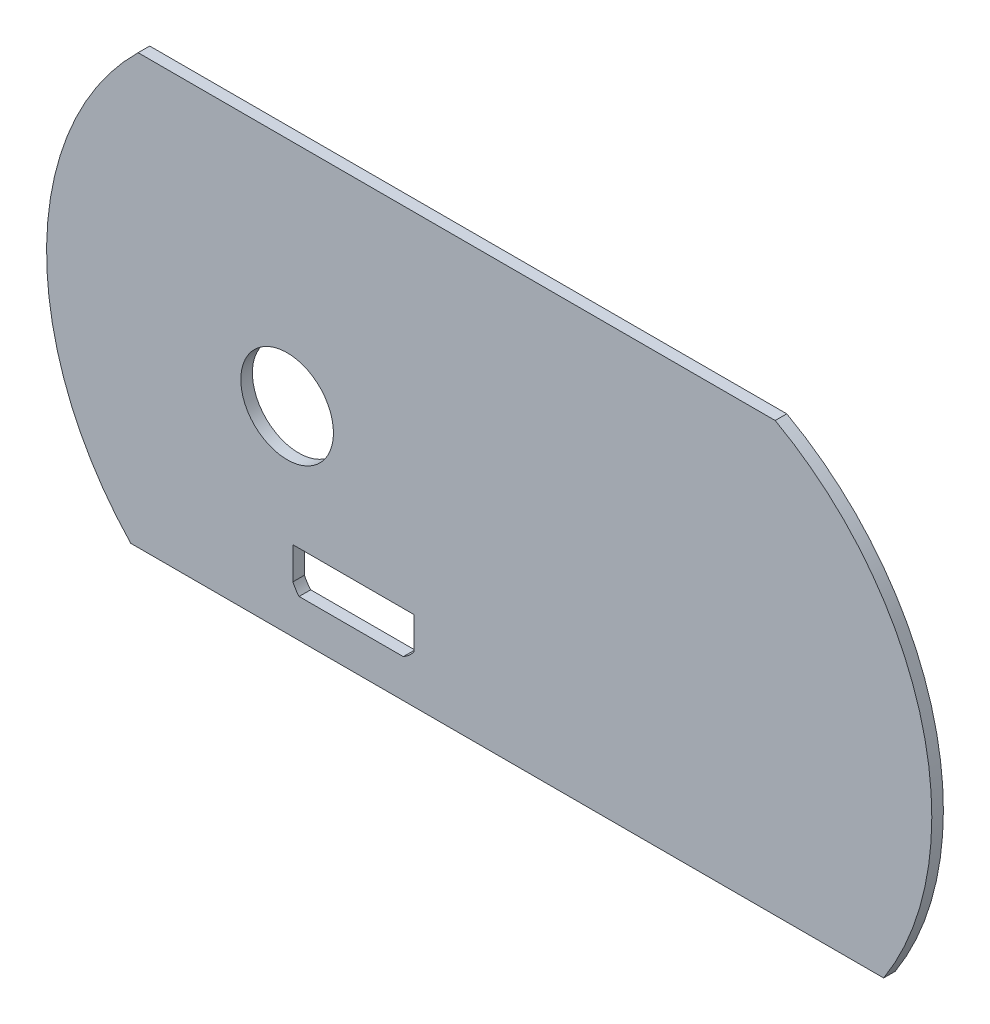
ISO-10303-21;
HEADER;
FILE_DESCRIPTION(('STEP AP214'),'2;1');
FILE_NAME('part.step','',(''),(''),'','','');
FILE_SCHEMA(('AUTOMOTIVE_DESIGN { 1 0 10303 214 1 1 1 1 }'));
ENDSEC;
DATA;
#1=APPLICATION_CONTEXT('core data for automotive mechanical design processes');
#2=APPLICATION_PROTOCOL_DEFINITION('international standard','automotive_design',2000,#1);
#3=PRODUCT_CONTEXT('',#1,'mechanical');
#4=PRODUCT('Part','Part','',(#3));
#5=PRODUCT_RELATED_PRODUCT_CATEGORY('part','',(#4));
#6=PRODUCT_DEFINITION_FORMATION('','',#4);
#7=PRODUCT_DEFINITION_CONTEXT('part definition',#1,'design');
#8=PRODUCT_DEFINITION('design','',#6,#7);
#9=PRODUCT_DEFINITION_SHAPE('','',#8);
#10=(LENGTH_UNIT() NAMED_UNIT(*) SI_UNIT(.MILLI.,.METRE.));
#11=(NAMED_UNIT(*) PLANE_ANGLE_UNIT() SI_UNIT($,.RADIAN.));
#12=(NAMED_UNIT(*) SI_UNIT($,.STERADIAN.) SOLID_ANGLE_UNIT());
#13=UNCERTAINTY_MEASURE_WITH_UNIT(LENGTH_MEASURE(1.E-05),#10,'distance_accuracy_value','');
#14=(GEOMETRIC_REPRESENTATION_CONTEXT(3) GLOBAL_UNCERTAINTY_ASSIGNED_CONTEXT((#13)) GLOBAL_UNIT_ASSIGNED_CONTEXT((#10,
#11,#12)) REPRESENTATION_CONTEXT('',''));
#15=CARTESIAN_POINT('',(0.,0.,0.));
#16=DIRECTION('',(0.,0.,1.));
#17=DIRECTION('',(1.,0.,0.));
#18=AXIS2_PLACEMENT_3D('',#15,#16,#17);
#19=CARTESIAN_POINT('',(-11.8487409175368,-0.32237688035865,1.));
#20=DIRECTION('',(0.,0.,1.));
#21=DIRECTION('',(1.,0.,0.));
#22=AXIS2_PLACEMENT_3D('',#19,#20,#21);
#23=PLANE('',#22);
#24=CARTESIAN_POINT('',(-14.1120289561096,-13.1393785409168,1.));
#25=DIRECTION('',(0.,0.,1.));
#26=DIRECTION('',(1.,0.,0.));
#27=AXIS2_PLACEMENT_3D('',#24,#25,#26);
#28=CIRCLE('',#27,3.09330565578541);
#29=CARTESIAN_POINT('',(-16.9440885597268,-14.3835562941634,1.));
#30=VERTEX_POINT('',#29);
#31=CARTESIAN_POINT('',(-16.4118007643872,-15.208095416172,1.));
#32=VERTEX_POINT('',#31);
#33=EDGE_CURVE('E126',#30,#32,#28,.T.);
#34=ORIENTED_EDGE('',*,*,#33,.F.);
#35=DIRECTION('',(0.,-1.,0.));
#36=VECTOR('',#35,1.);
#37=CARTESIAN_POINT('',(-16.9440885597268,-11.6039274244977,1.));
#38=LINE('',#37,#36);
#39=CARTESIAN_POINT('',(-16.9440885597268,-11.6039274244977,1.));
#40=VERTEX_POINT('',#39);
#41=EDGE_CURVE('E117',#40,#30,#38,.T.);
#42=ORIENTED_EDGE('',*,*,#41,.F.);
#43=DIRECTION('',(-1.,0.,0.));
#44=VECTOR('',#43,1.);
#45=CARTESIAN_POINT('',(-16.9440885597268,-11.6039274244977,1.));
#46=LINE('',#45,#44);
#47=CARTESIAN_POINT('',(-6.48484809463752,-11.6039274244977,1.));
#48=VERTEX_POINT('',#47);
#49=EDGE_CURVE('E154',#48,#40,#46,.T.);
#50=ORIENTED_EDGE('',*,*,#49,.F.);
#51=DIRECTION('',(0.,1.,0.));
#52=VECTOR('',#51,1.);
#53=CARTESIAN_POINT('',(-6.48484809463752,-11.6039274244977,1.));
#54=LINE('',#53,#52);
#55=CARTESIAN_POINT('',(-6.48484809463752,-14.3835562941634,1.));
#56=VERTEX_POINT('',#55);
#57=EDGE_CURVE('E151',#56,#48,#54,.T.);
#58=ORIENTED_EDGE('',*,*,#57,.F.);
#59=CARTESIAN_POINT('',(-8.91494735882746,-12.5832297906763,1.));
#60=DIRECTION('',(0.,0.,1.));
#61=DIRECTION('',(-1.,0.,0.));
#62=AXIS2_PLACEMENT_3D('',#59,#60,#61);
#63=CIRCLE('',#62,3.0243276861105);
#64=CARTESIAN_POINT('',(-7.41273618823069,-15.208095416172,1.));
#65=VERTEX_POINT('',#64);
#66=EDGE_CURVE('E145',#65,#56,#63,.T.);
#67=ORIENTED_EDGE('',*,*,#66,.F.);
#68=DIRECTION('',(1.,0.,0.));
#69=VECTOR('',#68,1.);
#70=CARTESIAN_POINT('',(-16.4118007643872,-15.208095416172,1.));
#71=LINE('',#70,#69);
#72=EDGE_CURVE('E141',#32,#65,#71,.T.);
#73=ORIENTED_EDGE('',*,*,#72,.F.);
#74=EDGE_LOOP('',(#34,#42,#50,#58,#67,#73));
#75=FACE_BOUND('',#74,.T.);
#76=CARTESIAN_POINT('',(-11.8487409175368,-0.32237688035865,1.));
#77=DIRECTION('',(0.,0.,1.));
#78=DIRECTION('',(1.,0.,0.));
#79=AXIS2_PLACEMENT_3D('',#76,#77,#78);
#80=CIRCLE('',#79,26.3639580460865);
#81=CARTESIAN_POINT('',(-30.3088712645725,18.5,1.));
#82=VERTEX_POINT('',#81);
#83=CARTESIAN_POINT('',(-30.9440885597268,-18.5,1.));
#84=VERTEX_POINT('',#83);
#85=EDGE_CURVE('E189',#82,#84,#80,.T.);
#86=ORIENTED_EDGE('',*,*,#85,.T.);
#87=DIRECTION('',(1.,0.,0.));
#88=VECTOR('',#87,1.);
#89=CARTESIAN_POINT('',(34.0559114402732,-18.5,1.));
#90=LINE('',#89,#88);
#91=CARTESIAN_POINT('',(34.0559114402733,-18.5,1.));
#92=VERTEX_POINT('',#91);
#93=EDGE_CURVE('E193',#84,#92,#90,.T.);
#94=ORIENTED_EDGE('',*,*,#93,.T.);
#95=CARTESIAN_POINT('',(12.1135567762488,-4.36853529477727,1.));
#96=DIRECTION('',(0.,0.,1.));
#97=DIRECTION('',(-1.,0.,0.));
#98=AXIS2_PLACEMENT_3D('',#95,#96,#97);
#99=CIRCLE('',#98,26.0991421873745);
#100=CARTESIAN_POINT('',(24.6911287354275,18.5,1.));
#101=VERTEX_POINT('',#100);
#102=EDGE_CURVE('E197',#92,#101,#99,.T.);
#103=ORIENTED_EDGE('',*,*,#102,.T.);
#104=DIRECTION('',(-1.,0.,0.));
#105=VECTOR('',#104,1.);
#106=CARTESIAN_POINT('',(-30.3088712645725,18.5,1.));
#107=LINE('',#106,#105);
#108=EDGE_CURVE('E200',#101,#82,#107,.T.);
#109=ORIENTED_EDGE('',*,*,#108,.T.);
#110=EDGE_LOOP('',(#86,#94,#103,#109));
#111=FACE_BOUND('',#110,.T.);
#112=CARTESIAN_POINT('',(-17.4440885597267,-1.5,1.));
#113=DIRECTION('',(0.,0.,1.));
#114=DIRECTION('',(1.,0.,0.));
#115=AXIS2_PLACEMENT_3D('',#112,#113,#114);
#116=CIRCLE('',#115,4.00000000000001);
#117=CARTESIAN_POINT('',(-13.4440885597267,-1.5,1.));
#118=VERTEX_POINT('',#117);
#119=EDGE_CURVE('E159',#118,#118,#116,.T.);
#120=ORIENTED_EDGE('',*,*,#119,.F.);
#121=EDGE_LOOP('',(#120));
#122=FACE_BOUND('',#121,.T.);
#123=ADVANCED_FACE('F39',(#75,#111,#122),#23,.T.);
#124=CARTESIAN_POINT('',(-11.8487409175368,-0.32237688035865,0.));
#125=DIRECTION('',(0.,0.,1.));
#126=DIRECTION('',(1.,0.,0.));
#127=AXIS2_PLACEMENT_3D('',#124,#125,#126);
#128=PLANE('',#127);
#129=CARTESIAN_POINT('',(-11.8487409175368,-0.32237688035865,0.));
#130=DIRECTION('',(0.,0.,1.));
#131=DIRECTION('',(1.,0.,0.));
#132=AXIS2_PLACEMENT_3D('',#129,#130,#131);
#133=CIRCLE('',#132,26.3639580460865);
#134=CARTESIAN_POINT('',(-30.3088712645725,18.5,0.));
#135=VERTEX_POINT('',#134);
#136=CARTESIAN_POINT('',(-30.9440885597268,-18.5,0.));
#137=VERTEX_POINT('',#136);
#138=EDGE_CURVE('E135',#135,#137,#133,.T.);
#139=ORIENTED_EDGE('',*,*,#138,.F.);
#140=DIRECTION('',(-1.,0.,0.));
#141=VECTOR('',#140,1.);
#142=CARTESIAN_POINT('',(-30.3088712645725,18.5,0.));
#143=LINE('',#142,#141);
#144=CARTESIAN_POINT('',(24.6911287354275,18.5,0.));
#145=VERTEX_POINT('',#144);
#146=EDGE_CURVE('E194',#145,#135,#143,.T.);
#147=ORIENTED_EDGE('',*,*,#146,.F.);
#148=CARTESIAN_POINT('',(12.1135567762488,-4.36853529477727,0.));
#149=DIRECTION('',(0.,0.,1.));
#150=DIRECTION('',(-1.,0.,0.));
#151=AXIS2_PLACEMENT_3D('',#148,#149,#150);
#152=CIRCLE('',#151,26.0991421873745);
#153=CARTESIAN_POINT('',(34.0559114402733,-18.5,0.));
#154=VERTEX_POINT('',#153);
#155=EDGE_CURVE('E210',#154,#145,#152,.T.);
#156=ORIENTED_EDGE('',*,*,#155,.F.);
#157=DIRECTION('',(1.,0.,0.));
#158=VECTOR('',#157,1.);
#159=CARTESIAN_POINT('',(34.0559114402732,-18.5,0.));
#160=LINE('',#159,#158);
#161=EDGE_CURVE('E207',#137,#154,#160,.T.);
#162=ORIENTED_EDGE('',*,*,#161,.F.);
#163=EDGE_LOOP('',(#139,#147,#156,#162));
#164=FACE_BOUND('',#163,.T.);
#165=DIRECTION('',(0.,-1.,0.));
#166=VECTOR('',#165,1.);
#167=CARTESIAN_POINT('',(-16.9440885597268,-11.6039274244977,0.));
#168=LINE('',#167,#166);
#169=CARTESIAN_POINT('',(-16.9440885597268,-11.6039274244977,0.));
#170=VERTEX_POINT('',#169);
#171=CARTESIAN_POINT('',(-16.9440885597268,-14.3835562941634,0.));
#172=VERTEX_POINT('',#171);
#173=EDGE_CURVE('E63',#170,#172,#168,.T.);
#174=ORIENTED_EDGE('',*,*,#173,.T.);
#175=CARTESIAN_POINT('',(-14.1120289561096,-13.1393785409168,0.));
#176=DIRECTION('',(0.,0.,1.));
#177=DIRECTION('',(1.,0.,0.));
#178=AXIS2_PLACEMENT_3D('',#175,#176,#177);
#179=CIRCLE('',#178,3.09330565578541);
#180=CARTESIAN_POINT('',(-16.4118007643872,-15.208095416172,0.));
#181=VERTEX_POINT('',#180);
#182=EDGE_CURVE('E133',#172,#181,#179,.T.);
#183=ORIENTED_EDGE('',*,*,#182,.T.);
#184=DIRECTION('',(1.,0.,0.));
#185=VECTOR('',#184,1.);
#186=CARTESIAN_POINT('',(-16.4118007643872,-15.208095416172,0.));
#187=LINE('',#186,#185);
#188=CARTESIAN_POINT('',(-7.41273618823069,-15.208095416172,0.));
#189=VERTEX_POINT('',#188);
#190=EDGE_CURVE('E162',#181,#189,#187,.T.);
#191=ORIENTED_EDGE('',*,*,#190,.T.);
#192=CARTESIAN_POINT('',(-8.91494735882746,-12.5832297906763,0.));
#193=DIRECTION('',(0.,0.,1.));
#194=DIRECTION('',(-1.,0.,0.));
#195=AXIS2_PLACEMENT_3D('',#192,#193,#194);
#196=CIRCLE('',#195,3.0243276861105);
#197=CARTESIAN_POINT('',(-6.48484809463752,-14.3835562941634,0.));
#198=VERTEX_POINT('',#197);
#199=EDGE_CURVE('E166',#189,#198,#196,.T.);
#200=ORIENTED_EDGE('',*,*,#199,.T.);
#201=DIRECTION('',(0.,1.,0.));
#202=VECTOR('',#201,1.);
#203=CARTESIAN_POINT('',(-6.48484809463752,-11.6039274244977,0.));
#204=LINE('',#203,#202);
#205=CARTESIAN_POINT('',(-6.48484809463752,-11.6039274244977,0.));
#206=VERTEX_POINT('',#205);
#207=EDGE_CURVE('E170',#198,#206,#204,.T.);
#208=ORIENTED_EDGE('',*,*,#207,.T.);
#209=DIRECTION('',(-1.,0.,0.));
#210=VECTOR('',#209,1.);
#211=CARTESIAN_POINT('',(-16.9440885597268,-11.6039274244977,0.));
#212=LINE('',#211,#210);
#213=EDGE_CURVE('E127',#206,#170,#212,.T.);
#214=ORIENTED_EDGE('',*,*,#213,.T.);
#215=EDGE_LOOP('',(#174,#183,#191,#200,#208,#214));
#216=FACE_BOUND('',#215,.T.);
#217=CARTESIAN_POINT('',(-17.4440885597267,-1.5,0.));
#218=DIRECTION('',(0.,0.,1.));
#219=DIRECTION('',(1.,0.,0.));
#220=AXIS2_PLACEMENT_3D('',#217,#218,#219);
#221=CIRCLE('',#220,4.00000000000001);
#222=CARTESIAN_POINT('',(-13.4440885597267,-1.5,0.));
#223=VERTEX_POINT('',#222);
#224=EDGE_CURVE('E294',#223,#223,#221,.T.);
#225=ORIENTED_EDGE('',*,*,#224,.T.);
#226=EDGE_LOOP('',(#225));
#227=FACE_BOUND('',#226,.T.);
#228=ADVANCED_FACE('F233',(#164,#216,#227),#128,.F.);
#229=CARTESIAN_POINT('',(-11.8487409175368,-0.32237688035865,1.));
#230=DIRECTION('',(0.,0.,-1.));
#231=DIRECTION('',(-1.,0.,0.));
#232=AXIS2_PLACEMENT_3D('',#229,#230,#231);
#233=CYLINDRICAL_SURFACE('',#232,26.3639580460865);
#234=ORIENTED_EDGE('',*,*,#138,.T.);
#235=DIRECTION('',(0.,0.,-1.));
#236=VECTOR('',#235,1.);
#237=CARTESIAN_POINT('',(-30.9440885597268,-18.5,1.));
#238=LINE('',#237,#236);
#239=EDGE_CURVE('E11',#84,#137,#238,.T.);
#240=ORIENTED_EDGE('',*,*,#239,.F.);
#241=ORIENTED_EDGE('',*,*,#85,.F.);
#242=DIRECTION('',(0.,0.,-1.));
#243=VECTOR('',#242,1.);
#244=CARTESIAN_POINT('',(-30.3088712645725,18.5,1.));
#245=LINE('',#244,#243);
#246=EDGE_CURVE('E203',#82,#135,#245,.T.);
#247=ORIENTED_EDGE('',*,*,#246,.T.);
#248=EDGE_LOOP('',(#234,#240,#241,#247));
#249=FACE_BOUND('',#248,.T.);
#250=ADVANCED_FACE('F41',(#249),#233,.T.);
#251=CARTESIAN_POINT('',(34.0559114402732,-18.5,1.));
#252=DIRECTION('',(0.,1.,0.));
#253=DIRECTION('',(-1.,0.,0.));
#254=AXIS2_PLACEMENT_3D('',#251,#252,#253);
#255=PLANE('',#254);
#256=ORIENTED_EDGE('',*,*,#161,.T.);
#257=DIRECTION('',(0.,0.,-1.));
#258=VECTOR('',#257,1.);
#259=CARTESIAN_POINT('',(34.0559114402733,-18.5,1.));
#260=LINE('',#259,#258);
#261=EDGE_CURVE('E48',#92,#154,#260,.T.);
#262=ORIENTED_EDGE('',*,*,#261,.F.);
#263=ORIENTED_EDGE('',*,*,#93,.F.);
#264=ORIENTED_EDGE('',*,*,#239,.T.);
#265=EDGE_LOOP('',(#256,#262,#263,#264));
#266=FACE_BOUND('',#265,.T.);
#267=ADVANCED_FACE('F243',(#266),#255,.F.);
#268=CARTESIAN_POINT('',(12.1135567762488,-4.36853529477727,1.));
#269=DIRECTION('',(0.,0.,-1.));
#270=DIRECTION('',(-1.,0.,0.));
#271=AXIS2_PLACEMENT_3D('',#268,#269,#270);
#272=CYLINDRICAL_SURFACE('',#271,26.0991421873745);
#273=ORIENTED_EDGE('',*,*,#155,.T.);
#274=DIRECTION('',(0.,0.,-1.));
#275=VECTOR('',#274,1.);
#276=CARTESIAN_POINT('',(24.6911287354275,18.5,1.));
#277=LINE('',#276,#275);
#278=EDGE_CURVE('E218',#101,#145,#277,.T.);
#279=ORIENTED_EDGE('',*,*,#278,.F.);
#280=ORIENTED_EDGE('',*,*,#102,.F.);
#281=ORIENTED_EDGE('',*,*,#261,.T.);
#282=EDGE_LOOP('',(#273,#279,#280,#281));
#283=FACE_BOUND('',#282,.T.);
#284=ADVANCED_FACE('F227',(#283),#272,.T.);
#285=CARTESIAN_POINT('',(-30.3088712645725,18.5,1.));
#286=DIRECTION('',(0.,-1.,0.));
#287=DIRECTION('',(0.,0.,-1.));
#288=AXIS2_PLACEMENT_3D('',#285,#286,#287);
#289=PLANE('',#288);
#290=ORIENTED_EDGE('',*,*,#146,.T.);
#291=ORIENTED_EDGE('',*,*,#246,.F.);
#292=ORIENTED_EDGE('',*,*,#108,.F.);
#293=ORIENTED_EDGE('',*,*,#278,.T.);
#294=EDGE_LOOP('',(#290,#291,#292,#293));
#295=FACE_BOUND('',#294,.T.);
#296=ADVANCED_FACE('F237',(#295),#289,.F.);
#297=CARTESIAN_POINT('',(-16.9440885597268,-11.6039274244977,1.));
#298=DIRECTION('',(1.,0.,0.));
#299=DIRECTION('',(0.,0.,-1.));
#300=AXIS2_PLACEMENT_3D('',#297,#298,#299);
#301=PLANE('',#300);
#302=ORIENTED_EDGE('',*,*,#173,.F.);
#303=DIRECTION('',(0.,0.,-1.));
#304=VECTOR('',#303,1.);
#305=CARTESIAN_POINT('',(-16.9440885597268,-11.6039274244977,1.));
#306=LINE('',#305,#304);
#307=EDGE_CURVE('E121',#40,#170,#306,.T.);
#308=ORIENTED_EDGE('',*,*,#307,.F.);
#309=ORIENTED_EDGE('',*,*,#41,.T.);
#310=DIRECTION('',(0.,0.,-1.));
#311=VECTOR('',#310,1.);
#312=CARTESIAN_POINT('',(-16.9440885597268,-14.3835562941634,1.));
#313=LINE('',#312,#311);
#314=EDGE_CURVE('E120',#30,#172,#313,.T.);
#315=ORIENTED_EDGE('',*,*,#314,.T.);
#316=EDGE_LOOP('',(#302,#308,#309,#315));
#317=FACE_BOUND('',#316,.T.);
#318=ADVANCED_FACE('F119',(#317),#301,.T.);
#319=CARTESIAN_POINT('',(-14.1120289561096,-13.1393785409168,1.));
#320=DIRECTION('',(0.,0.,-1.));
#321=DIRECTION('',(-1.,0.,0.));
#322=AXIS2_PLACEMENT_3D('',#319,#320,#321);
#323=CYLINDRICAL_SURFACE('',#322,3.09330565578541);
#324=ORIENTED_EDGE('',*,*,#182,.F.);
#325=ORIENTED_EDGE('',*,*,#314,.F.);
#326=ORIENTED_EDGE('',*,*,#33,.T.);
#327=DIRECTION('',(0.,0.,-1.));
#328=VECTOR('',#327,1.);
#329=CARTESIAN_POINT('',(-16.4118007643872,-15.208095416172,1.));
#330=LINE('',#329,#328);
#331=EDGE_CURVE('E136',#32,#181,#330,.T.);
#332=ORIENTED_EDGE('',*,*,#331,.T.);
#333=EDGE_LOOP('',(#324,#325,#326,#332));
#334=FACE_BOUND('',#333,.T.);
#335=ADVANCED_FACE('F130',(#334),#323,.F.);
#336=CARTESIAN_POINT('',(-16.4118007643872,-15.208095416172,1.));
#337=DIRECTION('',(0.,1.,0.));
#338=DIRECTION('',(0.,0.,1.));
#339=AXIS2_PLACEMENT_3D('',#336,#337,#338);
#340=PLANE('',#339);
#341=ORIENTED_EDGE('',*,*,#190,.F.);
#342=ORIENTED_EDGE('',*,*,#331,.F.);
#343=ORIENTED_EDGE('',*,*,#72,.T.);
#344=DIRECTION('',(0.,0.,-1.));
#345=VECTOR('',#344,1.);
#346=CARTESIAN_POINT('',(-7.41273618823069,-15.208095416172,1.));
#347=LINE('',#346,#345);
#348=EDGE_CURVE('E184',#65,#189,#347,.T.);
#349=ORIENTED_EDGE('',*,*,#348,.T.);
#350=EDGE_LOOP('',(#341,#342,#343,#349));
#351=FACE_BOUND('',#350,.T.);
#352=ADVANCED_FACE('F266',(#351),#340,.T.);
#353=CARTESIAN_POINT('',(-8.91494735882746,-12.5832297906763,1.));
#354=DIRECTION('',(0.,0.,-1.));
#355=DIRECTION('',(-1.,0.,0.));
#356=AXIS2_PLACEMENT_3D('',#353,#354,#355);
#357=CYLINDRICAL_SURFACE('',#356,3.0243276861105);
#358=ORIENTED_EDGE('',*,*,#199,.F.);
#359=ORIENTED_EDGE('',*,*,#348,.F.);
#360=ORIENTED_EDGE('',*,*,#66,.T.);
#361=DIRECTION('',(0.,0.,-1.));
#362=VECTOR('',#361,1.);
#363=CARTESIAN_POINT('',(-6.48484809463752,-14.3835562941634,1.));
#364=LINE('',#363,#362);
#365=EDGE_CURVE('E181',#56,#198,#364,.T.);
#366=ORIENTED_EDGE('',*,*,#365,.T.);
#367=EDGE_LOOP('',(#358,#359,#360,#366));
#368=FACE_BOUND('',#367,.T.);
#369=ADVANCED_FACE('F270',(#368),#357,.F.);
#370=CARTESIAN_POINT('',(-6.48484809463752,-11.6039274244977,1.));
#371=DIRECTION('',(-1.,0.,0.));
#372=DIRECTION('',(0.,0.,1.));
#373=AXIS2_PLACEMENT_3D('',#370,#371,#372);
#374=PLANE('',#373);
#375=ORIENTED_EDGE('',*,*,#207,.F.);
#376=ORIENTED_EDGE('',*,*,#365,.F.);
#377=ORIENTED_EDGE('',*,*,#57,.T.);
#378=DIRECTION('',(0.,0.,-1.));
#379=VECTOR('',#378,1.);
#380=CARTESIAN_POINT('',(-6.48484809463752,-11.6039274244977,1.));
#381=LINE('',#380,#379);
#382=EDGE_CURVE('E55',#48,#206,#381,.T.);
#383=ORIENTED_EDGE('',*,*,#382,.T.);
#384=EDGE_LOOP('',(#375,#376,#377,#383));
#385=FACE_BOUND('',#384,.T.);
#386=ADVANCED_FACE('F276',(#385),#374,.T.);
#387=CARTESIAN_POINT('',(-16.9440885597268,-11.6039274244977,1.));
#388=DIRECTION('',(0.,-1.,0.));
#389=DIRECTION('',(0.,0.,-1.));
#390=AXIS2_PLACEMENT_3D('',#387,#388,#389);
#391=PLANE('',#390);
#392=ORIENTED_EDGE('',*,*,#213,.F.);
#393=ORIENTED_EDGE('',*,*,#382,.F.);
#394=ORIENTED_EDGE('',*,*,#49,.T.);
#395=ORIENTED_EDGE('',*,*,#307,.T.);
#396=EDGE_LOOP('',(#392,#393,#394,#395));
#397=FACE_BOUND('',#396,.T.);
#398=ADVANCED_FACE('F280',(#397),#391,.T.);
#399=CARTESIAN_POINT('',(-17.4440885597267,-1.5,1.));
#400=DIRECTION('',(0.,0.,-1.));
#401=DIRECTION('',(-1.,0.,0.));
#402=AXIS2_PLACEMENT_3D('',#399,#400,#401);
#403=CYLINDRICAL_SURFACE('',#402,4.00000000000001);
#404=ORIENTED_EDGE('',*,*,#119,.T.);
#405=EDGE_LOOP('',(#404));
#406=FACE_BOUND('',#405,.T.);
#407=ORIENTED_EDGE('',*,*,#224,.F.);
#408=EDGE_LOOP('',(#407));
#409=FACE_BOUND('',#408,.T.);
#410=ADVANCED_FACE('F284',(#406,#409),#403,.F.);
#411=CLOSED_SHELL('',(#123,#228,#250,#267,#284,#296,#318,#335,#352,#369,#386,#398,#410));
#412=MANIFOLD_SOLID_BREP('B2',#411);
#413=ADVANCED_BREP_SHAPE_REPRESENTATION('',(#18,#412),#14);
#414=SHAPE_DEFINITION_REPRESENTATION(#9,#413);
ENDSEC;
END-ISO-10303-21;
